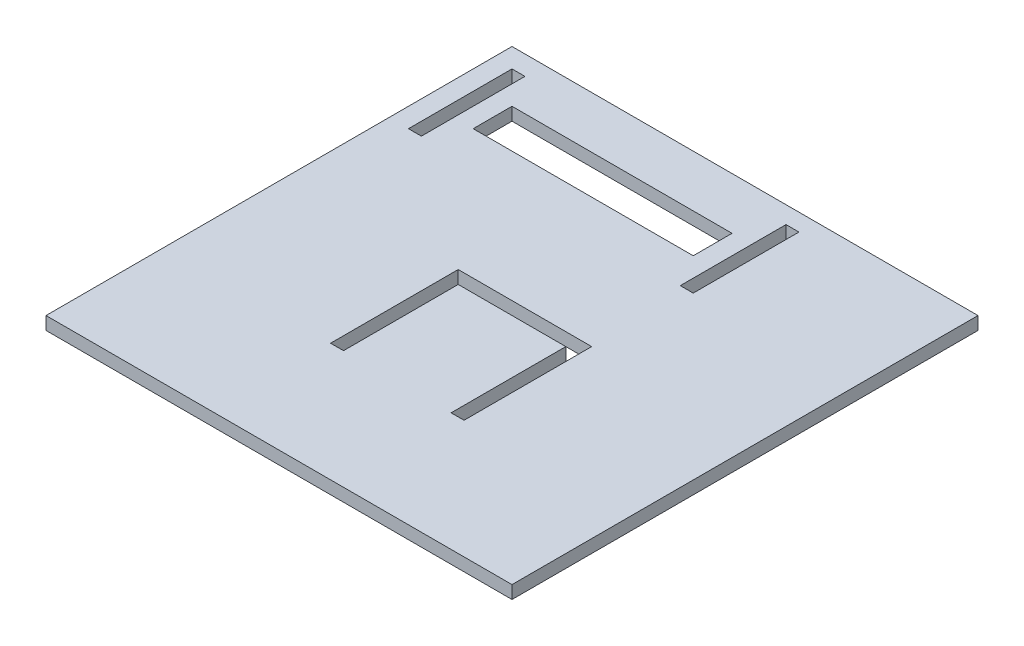
ISO-10303-21;
HEADER;
FILE_DESCRIPTION(('STEP AP214'),'2;1');
FILE_NAME('part.step','',(''),(''),'','','');
FILE_SCHEMA(('AUTOMOTIVE_DESIGN { 1 0 10303 214 1 1 1 1 }'));
ENDSEC;
DATA;
#1=APPLICATION_CONTEXT('core data for automotive mechanical design processes');
#2=APPLICATION_PROTOCOL_DEFINITION('international standard','automotive_design',2000,#1);
#3=PRODUCT_CONTEXT('',#1,'mechanical');
#4=PRODUCT('Part','Part','',(#3));
#5=PRODUCT_RELATED_PRODUCT_CATEGORY('part','',(#4));
#6=PRODUCT_DEFINITION_FORMATION('','',#4);
#7=PRODUCT_DEFINITION_CONTEXT('part definition',#1,'design');
#8=PRODUCT_DEFINITION('design','',#6,#7);
#9=PRODUCT_DEFINITION_SHAPE('','',#8);
#10=(LENGTH_UNIT() NAMED_UNIT(*) SI_UNIT(.MILLI.,.METRE.));
#11=(NAMED_UNIT(*) PLANE_ANGLE_UNIT() SI_UNIT($,.RADIAN.));
#12=(NAMED_UNIT(*) SI_UNIT($,.STERADIAN.) SOLID_ANGLE_UNIT());
#13=UNCERTAINTY_MEASURE_WITH_UNIT(LENGTH_MEASURE(1.E-05),#10,'distance_accuracy_value','');
#14=(GEOMETRIC_REPRESENTATION_CONTEXT(3) GLOBAL_UNCERTAINTY_ASSIGNED_CONTEXT((#13)) GLOBAL_UNIT_ASSIGNED_CONTEXT((#10,
#11,#12)) REPRESENTATION_CONTEXT('',''));
#15=CARTESIAN_POINT('',(0.,0.,0.));
#16=DIRECTION('',(0.,0.,1.));
#17=DIRECTION('',(1.,0.,0.));
#18=AXIS2_PLACEMENT_3D('',#15,#16,#17);
#19=CARTESIAN_POINT('',(0.,-3.175,-52.923862634009));
#20=DIRECTION('',(0.,0.,1.));
#21=DIRECTION('',(1.,0.,0.));
#22=AXIS2_PLACEMENT_3D('',#19,#20,#21);
#23=PLANE('',#22);
#24=DIRECTION('',(1.,0.,0.));
#25=VECTOR('',#24,1.);
#26=CARTESIAN_POINT('',(0.,0.,-52.923862634009));
#27=LINE('',#26,#25);
#28=CARTESIAN_POINT('',(14.2875,0.,-52.923862634009));
#29=VERTEX_POINT('',#28);
#30=CARTESIAN_POINT('',(17.4625,0.,-52.923862634009));
#31=VERTEX_POINT('',#30);
#32=EDGE_CURVE('E285',#29,#31,#27,.T.);
#33=ORIENTED_EDGE('',*,*,#32,.F.);
#34=DIRECTION('',(0.,1.,0.));
#35=VECTOR('',#34,1.);
#36=CARTESIAN_POINT('',(14.2875,-3.175,-52.923862634009));
#37=LINE('',#36,#35);
#38=CARTESIAN_POINT('',(14.2875,-3.175,-52.923862634009));
#39=VERTEX_POINT('',#38);
#40=EDGE_CURVE('E11',#39,#29,#37,.T.);
#41=ORIENTED_EDGE('',*,*,#40,.F.);
#42=DIRECTION('',(1.,0.,0.));
#43=VECTOR('',#42,1.);
#44=CARTESIAN_POINT('',(0.,-3.175,-52.923862634009));
#45=LINE('',#44,#43);
#46=CARTESIAN_POINT('',(17.4625,-3.175,-52.923862634009));
#47=VERTEX_POINT('',#46);
#48=EDGE_CURVE('E224',#39,#47,#45,.T.);
#49=ORIENTED_EDGE('',*,*,#48,.T.);
#50=DIRECTION('',(0.,1.,0.));
#51=VECTOR('',#50,1.);
#52=CARTESIAN_POINT('',(17.4625,-3.175,-52.923862634009));
#53=LINE('',#52,#51);
#54=EDGE_CURVE('E221',#47,#31,#53,.T.);
#55=ORIENTED_EDGE('',*,*,#54,.T.);
#56=EDGE_LOOP('',(#33,#41,#49,#55));
#57=FACE_BOUND('',#56,.T.);
#58=ADVANCED_FACE('F37',(#57),#23,.T.);
#59=CARTESIAN_POINT('',(14.2875,-3.175,0.));
#60=DIRECTION('',(-1.,0.,0.));
#61=DIRECTION('',(0.,0.,1.));
#62=AXIS2_PLACEMENT_3D('',#59,#60,#61);
#63=PLANE('',#62);
#64=DIRECTION('',(0.,0.,1.));
#65=VECTOR('',#64,1.);
#66=CARTESIAN_POINT('',(14.2875,0.,0.));
#67=LINE('',#66,#65);
#68=CARTESIAN_POINT('',(14.2875,0.,-26.9875));
#69=VERTEX_POINT('',#68);
#70=EDGE_CURVE('E291',#29,#69,#67,.T.);
#71=ORIENTED_EDGE('',*,*,#70,.T.);
#72=DIRECTION('',(0.,1.,0.));
#73=VECTOR('',#72,1.);
#74=CARTESIAN_POINT('',(14.2875,-3.175,-26.9875));
#75=LINE('',#74,#73);
#76=CARTESIAN_POINT('',(14.2875,-3.175,-26.9875));
#77=VERTEX_POINT('',#76);
#78=EDGE_CURVE('E47',#77,#69,#75,.T.);
#79=ORIENTED_EDGE('',*,*,#78,.F.);
#80=DIRECTION('',(0.,0.,1.));
#81=VECTOR('',#80,1.);
#82=CARTESIAN_POINT('',(14.2875,-3.175,0.));
#83=LINE('',#82,#81);
#84=EDGE_CURVE('E213',#39,#77,#83,.T.);
#85=ORIENTED_EDGE('',*,*,#84,.F.);
#86=ORIENTED_EDGE('',*,*,#40,.T.);
#87=EDGE_LOOP('',(#71,#79,#85,#86));
#88=FACE_BOUND('',#87,.T.);
#89=ADVANCED_FACE('F424',(#88),#63,.F.);
#90=CARTESIAN_POINT('',(0.,-3.175,-26.9875));
#91=DIRECTION('',(0.,0.,1.));
#92=DIRECTION('',(1.,0.,0.));
#93=AXIS2_PLACEMENT_3D('',#90,#91,#92);
#94=PLANE('',#93);
#95=DIRECTION('',(1.,0.,0.));
#96=VECTOR('',#95,1.);
#97=CARTESIAN_POINT('',(0.,0.,-26.9875));
#98=LINE('',#97,#96);
#99=CARTESIAN_POINT('',(17.4625,0.,-26.9875));
#100=VERTEX_POINT('',#99);
#101=EDGE_CURVE('E132',#69,#100,#98,.T.);
#102=ORIENTED_EDGE('',*,*,#101,.T.);
#103=DIRECTION('',(0.,1.,0.));
#104=VECTOR('',#103,1.);
#105=CARTESIAN_POINT('',(17.4625,-3.175,-26.9875));
#106=LINE('',#105,#104);
#107=CARTESIAN_POINT('',(17.4625,-3.175,-26.9875));
#108=VERTEX_POINT('',#107);
#109=EDGE_CURVE('E217',#108,#100,#106,.T.);
#110=ORIENTED_EDGE('',*,*,#109,.F.);
#111=DIRECTION('',(1.,0.,0.));
#112=VECTOR('',#111,1.);
#113=CARTESIAN_POINT('',(0.,-3.175,-26.9875));
#114=LINE('',#113,#112);
#115=EDGE_CURVE('E207',#77,#108,#114,.T.);
#116=ORIENTED_EDGE('',*,*,#115,.F.);
#117=ORIENTED_EDGE('',*,*,#78,.T.);
#118=EDGE_LOOP('',(#102,#110,#116,#117));
#119=FACE_BOUND('',#118,.T.);
#120=ADVANCED_FACE('F218',(#119),#94,.F.);
#121=CARTESIAN_POINT('',(0.,-3.175,57.15));
#122=DIRECTION('',(0.,0.,1.));
#123=DIRECTION('',(1.,0.,0.));
#124=AXIS2_PLACEMENT_3D('',#121,#122,#123);
#125=PLANE('',#124);
#126=DIRECTION('',(1.,0.,0.));
#127=VECTOR('',#126,1.);
#128=CARTESIAN_POINT('',(0.,0.,57.15));
#129=LINE('',#128,#127);
#130=CARTESIAN_POINT('',(-57.15,0.,57.15));
#131=VERTEX_POINT('',#130);
#132=CARTESIAN_POINT('',(57.15,0.,57.15));
#133=VERTEX_POINT('',#132);
#134=EDGE_CURVE('E273',#131,#133,#129,.T.);
#135=ORIENTED_EDGE('',*,*,#134,.F.);
#136=DIRECTION('',(0.,1.,0.));
#137=VECTOR('',#136,1.);
#138=CARTESIAN_POINT('',(-57.15,-3.175,57.15));
#139=LINE('',#138,#137);
#140=CARTESIAN_POINT('',(-57.15,-3.175,57.15));
#141=VERTEX_POINT('',#140);
#142=EDGE_CURVE('E296',#141,#131,#139,.T.);
#143=ORIENTED_EDGE('',*,*,#142,.F.);
#144=DIRECTION('',(1.,0.,0.));
#145=VECTOR('',#144,1.);
#146=CARTESIAN_POINT('',(0.,-3.175,57.15));
#147=LINE('',#146,#145);
#148=CARTESIAN_POINT('',(57.15,-3.175,57.15));
#149=VERTEX_POINT('',#148);
#150=EDGE_CURVE('E395',#141,#149,#147,.T.);
#151=ORIENTED_EDGE('',*,*,#150,.T.);
#152=DIRECTION('',(0.,1.,0.));
#153=VECTOR('',#152,1.);
#154=CARTESIAN_POINT('',(57.15,-3.175,57.15));
#155=LINE('',#154,#153);
#156=EDGE_CURVE('E303',#149,#133,#155,.T.);
#157=ORIENTED_EDGE('',*,*,#156,.T.);
#158=EDGE_LOOP('',(#135,#143,#151,#157));
#159=FACE_BOUND('',#158,.T.);
#160=ADVANCED_FACE('F419',(#159),#125,.T.);
#161=CARTESIAN_POINT('',(-57.15,-3.175,0.));
#162=DIRECTION('',(1.,0.,0.));
#163=DIRECTION('',(0.,0.,-1.));
#164=AXIS2_PLACEMENT_3D('',#161,#162,#163);
#165=PLANE('',#164);
#166=DIRECTION('',(0.,0.,-1.));
#167=VECTOR('',#166,1.);
#168=CARTESIAN_POINT('',(-57.15,0.,0.));
#169=LINE('',#168,#167);
#170=CARTESIAN_POINT('',(-57.15,0.,-57.15));
#171=VERTEX_POINT('',#170);
#172=EDGE_CURVE('E282',#131,#171,#169,.T.);
#173=ORIENTED_EDGE('',*,*,#172,.T.);
#174=DIRECTION('',(0.,1.,0.));
#175=VECTOR('',#174,1.);
#176=CARTESIAN_POINT('',(-57.15,-3.175,-57.15));
#177=LINE('',#176,#175);
#178=CARTESIAN_POINT('',(-57.15,-3.175,-57.15));
#179=VERTEX_POINT('',#178);
#180=EDGE_CURVE('E298',#179,#171,#177,.T.);
#181=ORIENTED_EDGE('',*,*,#180,.F.);
#182=DIRECTION('',(0.,0.,-1.));
#183=VECTOR('',#182,1.);
#184=CARTESIAN_POINT('',(-57.15,-3.175,0.));
#185=LINE('',#184,#183);
#186=EDGE_CURVE('E226',#141,#179,#185,.T.);
#187=ORIENTED_EDGE('',*,*,#186,.F.);
#188=ORIENTED_EDGE('',*,*,#142,.T.);
#189=EDGE_LOOP('',(#173,#181,#187,#188));
#190=FACE_BOUND('',#189,.T.);
#191=ADVANCED_FACE('F410',(#190),#165,.F.);
#192=CARTESIAN_POINT('',(0.,-3.175,-57.15));
#193=DIRECTION('',(0.,0.,1.));
#194=DIRECTION('',(1.,0.,0.));
#195=AXIS2_PLACEMENT_3D('',#192,#193,#194);
#196=PLANE('',#195);
#197=DIRECTION('',(1.,0.,0.));
#198=VECTOR('',#197,1.);
#199=CARTESIAN_POINT('',(0.,0.,-57.15));
#200=LINE('',#199,#198);
#201=CARTESIAN_POINT('',(57.15,0.,-57.15));
#202=VERTEX_POINT('',#201);
#203=EDGE_CURVE('E279',#171,#202,#200,.T.);
#204=ORIENTED_EDGE('',*,*,#203,.T.);
#205=DIRECTION('',(0.,1.,0.));
#206=VECTOR('',#205,1.);
#207=CARTESIAN_POINT('',(57.15,-3.175,-57.15));
#208=LINE('',#207,#206);
#209=CARTESIAN_POINT('',(57.15,-3.175,-57.15));
#210=VERTEX_POINT('',#209);
#211=EDGE_CURVE('E301',#210,#202,#208,.T.);
#212=ORIENTED_EDGE('',*,*,#211,.F.);
#213=DIRECTION('',(1.,0.,0.));
#214=VECTOR('',#213,1.);
#215=CARTESIAN_POINT('',(0.,-3.175,-57.15));
#216=LINE('',#215,#214);
#217=EDGE_CURVE('E401',#179,#210,#216,.T.);
#218=ORIENTED_EDGE('',*,*,#217,.F.);
#219=ORIENTED_EDGE('',*,*,#180,.T.);
#220=EDGE_LOOP('',(#204,#212,#218,#219));
#221=FACE_BOUND('',#220,.T.);
#222=ADVANCED_FACE('F413',(#221),#196,.F.);
#223=CARTESIAN_POINT('',(0.,-3.175,28.1323095017298));
#224=DIRECTION('',(0.,0.,1.));
#225=DIRECTION('',(1.,0.,0.));
#226=AXIS2_PLACEMENT_3D('',#223,#224,#225);
#227=PLANE('',#226);
#228=DIRECTION('',(1.,0.,0.));
#229=VECTOR('',#228,1.);
#230=CARTESIAN_POINT('',(0.,0.,28.1323095017298));
#231=LINE('',#230,#229);
#232=CARTESIAN_POINT('',(13.1953,0.,28.1323095017298));
#233=VERTEX_POINT('',#232);
#234=CARTESIAN_POINT('',(16.3703,0.,28.1323095017298));
#235=VERTEX_POINT('',#234);
#236=EDGE_CURVE('E253',#233,#235,#231,.T.);
#237=ORIENTED_EDGE('',*,*,#236,.T.);
#238=DIRECTION('',(0.,1.,0.));
#239=VECTOR('',#238,1.);
#240=CARTESIAN_POINT('',(16.3703,-3.175,28.1323095017298));
#241=LINE('',#240,#239);
#242=CARTESIAN_POINT('',(16.3703,-3.175,28.1323095017298));
#243=VERTEX_POINT('',#242);
#244=EDGE_CURVE('E305',#243,#235,#241,.T.);
#245=ORIENTED_EDGE('',*,*,#244,.F.);
#246=DIRECTION('',(1.,0.,0.));
#247=VECTOR('',#246,1.);
#248=CARTESIAN_POINT('',(0.,-3.175,28.1323095017298));
#249=LINE('',#248,#247);
#250=CARTESIAN_POINT('',(13.1953,-3.175,28.1323095017298));
#251=VERTEX_POINT('',#250);
#252=EDGE_CURVE('E376',#251,#243,#249,.T.);
#253=ORIENTED_EDGE('',*,*,#252,.F.);
#254=DIRECTION('',(0.,1.,0.));
#255=VECTOR('',#254,1.);
#256=CARTESIAN_POINT('',(13.1953,-3.175,28.1323095017298));
#257=LINE('',#256,#255);
#258=EDGE_CURVE('E322',#251,#233,#257,.T.);
#259=ORIENTED_EDGE('',*,*,#258,.T.);
#260=EDGE_LOOP('',(#237,#245,#253,#259));
#261=FACE_BOUND('',#260,.T.);
#262=ADVANCED_FACE('F437',(#261),#227,.F.);
#263=CARTESIAN_POINT('',(16.3703,-3.175,0.));
#264=DIRECTION('',(-1.,0.,0.));
#265=DIRECTION('',(0.,0.,1.));
#266=AXIS2_PLACEMENT_3D('',#263,#264,#265);
#267=PLANE('',#266);
#268=DIRECTION('',(0.,0.,1.));
#269=VECTOR('',#268,1.);
#270=CARTESIAN_POINT('',(16.3703,0.,0.));
#271=LINE('',#270,#269);
#272=CARTESIAN_POINT('',(16.3703,0.,-3.175));
#273=VERTEX_POINT('',#272);
#274=EDGE_CURVE('E270',#273,#235,#271,.T.);
#275=ORIENTED_EDGE('',*,*,#274,.F.);
#276=DIRECTION('',(0.,1.,0.));
#277=VECTOR('',#276,1.);
#278=CARTESIAN_POINT('',(16.3703,-3.175,-3.175));
#279=LINE('',#278,#277);
#280=CARTESIAN_POINT('',(16.3703,-3.175,-3.175));
#281=VERTEX_POINT('',#280);
#282=EDGE_CURVE('E307',#281,#273,#279,.T.);
#283=ORIENTED_EDGE('',*,*,#282,.F.);
#284=DIRECTION('',(0.,0.,1.));
#285=VECTOR('',#284,1.);
#286=CARTESIAN_POINT('',(16.3703,-3.175,0.));
#287=LINE('',#286,#285);
#288=EDGE_CURVE('E392',#281,#243,#287,.T.);
#289=ORIENTED_EDGE('',*,*,#288,.T.);
#290=ORIENTED_EDGE('',*,*,#244,.T.);
#291=EDGE_LOOP('',(#275,#283,#289,#290));
#292=FACE_BOUND('',#291,.T.);
#293=ADVANCED_FACE('F443',(#292),#267,.T.);
#294=CARTESIAN_POINT('',(0.,-3.175,-3.175));
#295=DIRECTION('',(0.,0.,1.));
#296=DIRECTION('',(1.,0.,0.));
#297=AXIS2_PLACEMENT_3D('',#294,#295,#296);
#298=PLANE('',#297);
#299=DIRECTION('',(1.,0.,0.));
#300=VECTOR('',#299,1.);
#301=CARTESIAN_POINT('',(0.,0.,-3.175));
#302=LINE('',#301,#300);
#303=CARTESIAN_POINT('',(-16.3703,0.,-3.17499999999999));
#304=VERTEX_POINT('',#303);
#305=EDGE_CURVE('E267',#304,#273,#302,.T.);
#306=ORIENTED_EDGE('',*,*,#305,.F.);
#307=DIRECTION('',(0.,1.,0.));
#308=VECTOR('',#307,1.);
#309=CARTESIAN_POINT('',(-16.3703,-3.175,-3.17499999999999));
#310=LINE('',#309,#308);
#311=CARTESIAN_POINT('',(-16.3703,-3.175,-3.17499999999999));
#312=VERTEX_POINT('',#311);
#313=EDGE_CURVE('E309',#312,#304,#310,.T.);
#314=ORIENTED_EDGE('',*,*,#313,.F.);
#315=DIRECTION('',(1.,0.,0.));
#316=VECTOR('',#315,1.);
#317=CARTESIAN_POINT('',(0.,-3.175,-3.175));
#318=LINE('',#317,#316);
#319=EDGE_CURVE('E389',#312,#281,#318,.T.);
#320=ORIENTED_EDGE('',*,*,#319,.T.);
#321=ORIENTED_EDGE('',*,*,#282,.T.);
#322=EDGE_LOOP('',(#306,#314,#320,#321));
#323=FACE_BOUND('',#322,.T.);
#324=ADVANCED_FACE('F446',(#323),#298,.T.);
#325=CARTESIAN_POINT('',(-16.3703,-3.175,0.));
#326=DIRECTION('',(1.,0.,0.));
#327=DIRECTION('',(0.,0.,-1.));
#328=AXIS2_PLACEMENT_3D('',#325,#326,#327);
#329=PLANE('',#328);
#330=DIRECTION('',(0.,0.,-1.));
#331=VECTOR('',#330,1.);
#332=CARTESIAN_POINT('',(-16.3703,0.,0.));
#333=LINE('',#332,#331);
#334=CARTESIAN_POINT('',(-16.3703,0.,28.1323095017298));
#335=VERTEX_POINT('',#334);
#336=EDGE_CURVE('E264',#335,#304,#333,.T.);
#337=ORIENTED_EDGE('',*,*,#336,.F.);
#338=DIRECTION('',(0.,1.,0.));
#339=VECTOR('',#338,1.);
#340=CARTESIAN_POINT('',(-16.3703,-3.175,28.1323095017298));
#341=LINE('',#340,#339);
#342=CARTESIAN_POINT('',(-16.3703,-3.175,28.1323095017298));
#343=VERTEX_POINT('',#342);
#344=EDGE_CURVE('E311',#343,#335,#341,.T.);
#345=ORIENTED_EDGE('',*,*,#344,.F.);
#346=DIRECTION('',(0.,0.,-1.));
#347=VECTOR('',#346,1.);
#348=CARTESIAN_POINT('',(-16.3703,-3.175,0.));
#349=LINE('',#348,#347);
#350=EDGE_CURVE('E386',#343,#312,#349,.T.);
#351=ORIENTED_EDGE('',*,*,#350,.T.);
#352=ORIENTED_EDGE('',*,*,#313,.T.);
#353=EDGE_LOOP('',(#337,#345,#351,#352));
#354=FACE_BOUND('',#353,.T.);
#355=ADVANCED_FACE('F450',(#354),#329,.T.);
#356=CARTESIAN_POINT('',(0.,-3.175,28.1323095017298));
#357=DIRECTION('',(0.,0.,1.));
#358=DIRECTION('',(1.,0.,0.));
#359=AXIS2_PLACEMENT_3D('',#356,#357,#358);
#360=PLANE('',#359);
#361=DIRECTION('',(1.,0.,0.));
#362=VECTOR('',#361,1.);
#363=CARTESIAN_POINT('',(0.,0.,28.1323095017298));
#364=LINE('',#363,#362);
#365=CARTESIAN_POINT('',(-13.1953,0.,28.1323095017298));
#366=VERTEX_POINT('',#365);
#367=EDGE_CURVE('E262',#335,#366,#364,.T.);
#368=ORIENTED_EDGE('',*,*,#367,.T.);
#369=DIRECTION('',(0.,1.,0.));
#370=VECTOR('',#369,1.);
#371=CARTESIAN_POINT('',(-13.1953,-3.175,28.1323095017298));
#372=LINE('',#371,#370);
#373=CARTESIAN_POINT('',(-13.1953,-3.175,28.1323095017298));
#374=VERTEX_POINT('',#373);
#375=EDGE_CURVE('E313',#374,#366,#372,.T.);
#376=ORIENTED_EDGE('',*,*,#375,.F.);
#377=DIRECTION('',(1.,0.,0.));
#378=VECTOR('',#377,1.);
#379=CARTESIAN_POINT('',(0.,-3.175,28.1323095017298));
#380=LINE('',#379,#378);
#381=EDGE_CURVE('E384',#343,#374,#380,.T.);
#382=ORIENTED_EDGE('',*,*,#381,.F.);
#383=ORIENTED_EDGE('',*,*,#344,.T.);
#384=EDGE_LOOP('',(#368,#376,#382,#383));
#385=FACE_BOUND('',#384,.T.);
#386=ADVANCED_FACE('F454',(#385),#360,.F.);
#387=CARTESIAN_POINT('',(-13.1953,-3.175,0.));
#388=DIRECTION('',(1.,0.,0.));
#389=DIRECTION('',(0.,0.,-1.));
#390=AXIS2_PLACEMENT_3D('',#387,#388,#389);
#391=PLANE('',#390);
#392=DIRECTION('',(0.,0.,-1.));
#393=VECTOR('',#392,1.);
#394=CARTESIAN_POINT('',(-13.1953,0.,0.));
#395=LINE('',#394,#393);
#396=CARTESIAN_POINT('',(-13.1953,0.,0.));
#397=VERTEX_POINT('',#396);
#398=EDGE_CURVE('E260',#366,#397,#395,.T.);
#399=ORIENTED_EDGE('',*,*,#398,.T.);
#400=DIRECTION('',(0.,1.,0.));
#401=VECTOR('',#400,1.);
#402=CARTESIAN_POINT('',(-13.1953,-3.175,0.));
#403=LINE('',#402,#401);
#404=CARTESIAN_POINT('',(-13.1953,-3.175,0.));
#405=VERTEX_POINT('',#404);
#406=EDGE_CURVE('E316',#405,#397,#403,.T.);
#407=ORIENTED_EDGE('',*,*,#406,.F.);
#408=DIRECTION('',(0.,0.,-1.));
#409=VECTOR('',#408,1.);
#410=CARTESIAN_POINT('',(-13.1953,-3.175,0.));
#411=LINE('',#410,#409);
#412=EDGE_CURVE('E382',#374,#405,#411,.T.);
#413=ORIENTED_EDGE('',*,*,#412,.F.);
#414=ORIENTED_EDGE('',*,*,#375,.T.);
#415=EDGE_LOOP('',(#399,#407,#413,#414));
#416=FACE_BOUND('',#415,.T.);
#417=ADVANCED_FACE('F458',(#416),#391,.F.);
#418=CARTESIAN_POINT('',(0.,-3.175,0.));
#419=DIRECTION('',(0.,0.,1.));
#420=DIRECTION('',(1.,0.,0.));
#421=AXIS2_PLACEMENT_3D('',#418,#419,#420);
#422=PLANE('',#421);
#423=DIRECTION('',(1.,0.,0.));
#424=VECTOR('',#423,1.);
#425=CARTESIAN_POINT('',(0.,0.,0.));
#426=LINE('',#425,#424);
#427=CARTESIAN_POINT('',(13.1953,0.,0.));
#428=VERTEX_POINT('',#427);
#429=EDGE_CURVE('E258',#397,#428,#426,.T.);
#430=ORIENTED_EDGE('',*,*,#429,.T.);
#431=DIRECTION('',(0.,1.,0.));
#432=VECTOR('',#431,1.);
#433=CARTESIAN_POINT('',(13.1953,-3.175,0.));
#434=LINE('',#433,#432);
#435=CARTESIAN_POINT('',(13.1953,-3.175,0.));
#436=VERTEX_POINT('',#435);
#437=EDGE_CURVE('E319',#436,#428,#434,.T.);
#438=ORIENTED_EDGE('',*,*,#437,.F.);
#439=DIRECTION('',(1.,0.,0.));
#440=VECTOR('',#439,1.);
#441=CARTESIAN_POINT('',(0.,-3.175,0.));
#442=LINE('',#441,#440);
#443=EDGE_CURVE('E380',#405,#436,#442,.T.);
#444=ORIENTED_EDGE('',*,*,#443,.F.);
#445=ORIENTED_EDGE('',*,*,#406,.T.);
#446=EDGE_LOOP('',(#430,#438,#444,#445));
#447=FACE_BOUND('',#446,.T.);
#448=ADVANCED_FACE('F462',(#447),#422,.F.);
#449=CARTESIAN_POINT('',(9.52499999999999,-3.175,0.));
#450=DIRECTION('',(1.,0.,0.));
#451=DIRECTION('',(0.,0.,-1.));
#452=AXIS2_PLACEMENT_3D('',#449,#450,#451);
#453=PLANE('',#452);
#454=DIRECTION('',(0.,0.,-1.));
#455=VECTOR('',#454,1.);
#456=CARTESIAN_POINT('',(9.52499999999999,0.,0.));
#457=LINE('',#456,#455);
#458=CARTESIAN_POINT('',(9.52499999999999,0.,-34.925));
#459=VERTEX_POINT('',#458);
#460=CARTESIAN_POINT('',(9.52499999999999,0.,-44.45));
#461=VERTEX_POINT('',#460);
#462=EDGE_CURVE('E242',#459,#461,#457,.T.);
#463=ORIENTED_EDGE('',*,*,#462,.T.);
#464=DIRECTION('',(0.,1.,0.));
#465=VECTOR('',#464,1.);
#466=CARTESIAN_POINT('',(9.52499999999999,-3.175,-44.45));
#467=LINE('',#466,#465);
#468=CARTESIAN_POINT('',(9.52499999999999,-3.175,-44.45));
#469=VERTEX_POINT('',#468);
#470=EDGE_CURVE('E325',#469,#461,#467,.T.);
#471=ORIENTED_EDGE('',*,*,#470,.F.);
#472=DIRECTION('',(0.,0.,-1.));
#473=VECTOR('',#472,1.);
#474=CARTESIAN_POINT('',(9.52499999999999,-3.175,0.));
#475=LINE('',#474,#473);
#476=CARTESIAN_POINT('',(9.52499999999999,-3.175,-34.925));
#477=VERTEX_POINT('',#476);
#478=EDGE_CURVE('E362',#477,#469,#475,.T.);
#479=ORIENTED_EDGE('',*,*,#478,.F.);
#480=DIRECTION('',(0.,1.,0.));
#481=VECTOR('',#480,1.);
#482=CARTESIAN_POINT('',(9.52499999999999,-3.175,-34.925));
#483=LINE('',#482,#481);
#484=EDGE_CURVE('E331',#477,#459,#483,.T.);
#485=ORIENTED_EDGE('',*,*,#484,.T.);
#486=EDGE_LOOP('',(#463,#471,#479,#485));
#487=FACE_BOUND('',#486,.T.);
#488=ADVANCED_FACE('F466',(#487),#453,.F.);
#489=CARTESIAN_POINT('',(0.,-3.175,-44.45));
#490=DIRECTION('',(0.,0.,1.));
#491=DIRECTION('',(1.,0.,0.));
#492=AXIS2_PLACEMENT_3D('',#489,#490,#491);
#493=PLANE('',#492);
#494=DIRECTION('',(1.,0.,0.));
#495=VECTOR('',#494,1.);
#496=CARTESIAN_POINT('',(0.,0.,-44.45));
#497=LINE('',#496,#495);
#498=CARTESIAN_POINT('',(-44.45,0.,-44.45));
#499=VERTEX_POINT('',#498);
#500=EDGE_CURVE('E250',#499,#461,#497,.T.);
#501=ORIENTED_EDGE('',*,*,#500,.F.);
#502=DIRECTION('',(0.,1.,0.));
#503=VECTOR('',#502,1.);
#504=CARTESIAN_POINT('',(-44.45,-3.175,-44.45));
#505=LINE('',#504,#503);
#506=CARTESIAN_POINT('',(-44.45,-3.175,-44.45));
#507=VERTEX_POINT('',#506);
#508=EDGE_CURVE('E327',#507,#499,#505,.T.);
#509=ORIENTED_EDGE('',*,*,#508,.F.);
#510=DIRECTION('',(1.,0.,0.));
#511=VECTOR('',#510,1.);
#512=CARTESIAN_POINT('',(0.,-3.175,-44.45));
#513=LINE('',#512,#511);
#514=EDGE_CURVE('E373',#507,#469,#513,.T.);
#515=ORIENTED_EDGE('',*,*,#514,.T.);
#516=ORIENTED_EDGE('',*,*,#470,.T.);
#517=EDGE_LOOP('',(#501,#509,#515,#516));
#518=FACE_BOUND('',#517,.T.);
#519=ADVANCED_FACE('F475',(#518),#493,.T.);
#520=CARTESIAN_POINT('',(-44.45,-3.175,0.));
#521=DIRECTION('',(1.,0.,0.));
#522=DIRECTION('',(0.,0.,-1.));
#523=AXIS2_PLACEMENT_3D('',#520,#521,#522);
#524=PLANE('',#523);
#525=DIRECTION('',(0.,0.,-1.));
#526=VECTOR('',#525,1.);
#527=CARTESIAN_POINT('',(-44.45,0.,0.));
#528=LINE('',#527,#526);
#529=CARTESIAN_POINT('',(-44.45,0.,-34.925));
#530=VERTEX_POINT('',#529);
#531=EDGE_CURVE('E247',#530,#499,#528,.T.);
#532=ORIENTED_EDGE('',*,*,#531,.F.);
#533=DIRECTION('',(0.,1.,0.));
#534=VECTOR('',#533,1.);
#535=CARTESIAN_POINT('',(-44.45,-3.175,-34.925));
#536=LINE('',#535,#534);
#537=CARTESIAN_POINT('',(-44.45,-3.175,-34.925));
#538=VERTEX_POINT('',#537);
#539=EDGE_CURVE('E329',#538,#530,#536,.T.);
#540=ORIENTED_EDGE('',*,*,#539,.F.);
#541=DIRECTION('',(0.,0.,-1.));
#542=VECTOR('',#541,1.);
#543=CARTESIAN_POINT('',(-44.45,-3.175,0.));
#544=LINE('',#543,#542);
#545=EDGE_CURVE('E370',#538,#507,#544,.T.);
#546=ORIENTED_EDGE('',*,*,#545,.T.);
#547=ORIENTED_EDGE('',*,*,#508,.T.);
#548=EDGE_LOOP('',(#532,#540,#546,#547));
#549=FACE_BOUND('',#548,.T.);
#550=ADVANCED_FACE('F478',(#549),#524,.T.);
#551=CARTESIAN_POINT('',(0.,-3.175,-52.3875));
#552=DIRECTION('',(0.,0.,1.));
#553=DIRECTION('',(1.,0.,0.));
#554=AXIS2_PLACEMENT_3D('',#551,#552,#553);
#555=PLANE('',#554);
#556=DIRECTION('',(1.,0.,0.));
#557=VECTOR('',#556,1.);
#558=CARTESIAN_POINT('',(0.,0.,-52.3875));
#559=LINE('',#558,#557);
#560=CARTESIAN_POINT('',(-52.3875,0.,-52.3875));
#561=VERTEX_POINT('',#560);
#562=CARTESIAN_POINT('',(-49.2125,0.,-52.3875));
#563=VERTEX_POINT('',#562);
#564=EDGE_CURVE('E231',#561,#563,#559,.T.);
#565=ORIENTED_EDGE('',*,*,#564,.F.);
#566=DIRECTION('',(0.,1.,0.));
#567=VECTOR('',#566,1.);
#568=CARTESIAN_POINT('',(-52.3875,-3.175,-52.3875));
#569=LINE('',#568,#567);
#570=CARTESIAN_POINT('',(-52.3875,-3.175,-52.3875));
#571=VERTEX_POINT('',#570);
#572=EDGE_CURVE('E334',#571,#561,#569,.T.);
#573=ORIENTED_EDGE('',*,*,#572,.F.);
#574=DIRECTION('',(1.,0.,0.));
#575=VECTOR('',#574,1.);
#576=CARTESIAN_POINT('',(0.,-3.175,-52.3875));
#577=LINE('',#576,#575);
#578=CARTESIAN_POINT('',(-49.2125,-3.175,-52.3875));
#579=VERTEX_POINT('',#578);
#580=EDGE_CURVE('E292',#571,#579,#577,.T.);
#581=ORIENTED_EDGE('',*,*,#580,.T.);
#582=DIRECTION('',(0.,1.,0.));
#583=VECTOR('',#582,1.);
#584=CARTESIAN_POINT('',(-49.2125,-3.175,-52.3875));
#585=LINE('',#584,#583);
#586=EDGE_CURVE('E41',#579,#563,#585,.T.);
#587=ORIENTED_EDGE('',*,*,#586,.T.);
#588=EDGE_LOOP('',(#565,#573,#581,#587));
#589=FACE_BOUND('',#588,.T.);
#590=ADVANCED_FACE('F39',(#589),#555,.T.);
#591=CARTESIAN_POINT('',(-52.3875,-3.175,0.));
#592=DIRECTION('',(-1.,0.,0.));
#593=DIRECTION('',(0.,0.,1.));
#594=AXIS2_PLACEMENT_3D('',#591,#592,#593);
#595=PLANE('',#594);
#596=DIRECTION('',(0.,0.,1.));
#597=VECTOR('',#596,1.);
#598=CARTESIAN_POINT('',(-52.3875,0.,0.));
#599=LINE('',#598,#597);
#600=CARTESIAN_POINT('',(-52.3875,0.,-26.9875));
#601=VERTEX_POINT('',#600);
#602=EDGE_CURVE('E240',#561,#601,#599,.T.);
#603=ORIENTED_EDGE('',*,*,#602,.T.);
#604=DIRECTION('',(0.,1.,0.));
#605=VECTOR('',#604,1.);
#606=CARTESIAN_POINT('',(-52.3875,-3.175,-26.9875));
#607=LINE('',#606,#605);
#608=CARTESIAN_POINT('',(-52.3875,-3.175,-26.9875));
#609=VERTEX_POINT('',#608);
#610=EDGE_CURVE('E336',#609,#601,#607,.T.);
#611=ORIENTED_EDGE('',*,*,#610,.F.);
#612=DIRECTION('',(0.,0.,1.));
#613=VECTOR('',#612,1.);
#614=CARTESIAN_POINT('',(-52.3875,-3.175,0.));
#615=LINE('',#614,#613);
#616=EDGE_CURVE('E359',#571,#609,#615,.T.);
#617=ORIENTED_EDGE('',*,*,#616,.F.);
#618=ORIENTED_EDGE('',*,*,#572,.T.);
#619=EDGE_LOOP('',(#603,#611,#617,#618));
#620=FACE_BOUND('',#619,.T.);
#621=ADVANCED_FACE('F352',(#620),#595,.F.);
#622=CARTESIAN_POINT('',(0.,-3.175,-26.9875));
#623=DIRECTION('',(0.,0.,1.));
#624=DIRECTION('',(1.,0.,0.));
#625=AXIS2_PLACEMENT_3D('',#622,#623,#624);
#626=PLANE('',#625);
#627=DIRECTION('',(1.,0.,0.));
#628=VECTOR('',#627,1.);
#629=CARTESIAN_POINT('',(0.,0.,-26.9875));
#630=LINE('',#629,#628);
#631=CARTESIAN_POINT('',(-49.2125,0.,-26.9875));
#632=VERTEX_POINT('',#631);
#633=EDGE_CURVE('E237',#601,#632,#630,.T.);
#634=ORIENTED_EDGE('',*,*,#633,.T.);
#635=DIRECTION('',(0.,1.,0.));
#636=VECTOR('',#635,1.);
#637=CARTESIAN_POINT('',(-49.2125,-3.175,-26.9875));
#638=LINE('',#637,#636);
#639=CARTESIAN_POINT('',(-49.2125,-3.175,-26.9875));
#640=VERTEX_POINT('',#639);
#641=EDGE_CURVE('E338',#640,#632,#638,.T.);
#642=ORIENTED_EDGE('',*,*,#641,.F.);
#643=DIRECTION('',(1.,0.,0.));
#644=VECTOR('',#643,1.);
#645=CARTESIAN_POINT('',(0.,-3.175,-26.9875));
#646=LINE('',#645,#644);
#647=EDGE_CURVE('E357',#609,#640,#646,.T.);
#648=ORIENTED_EDGE('',*,*,#647,.F.);
#649=ORIENTED_EDGE('',*,*,#610,.T.);
#650=EDGE_LOOP('',(#634,#642,#648,#649));
#651=FACE_BOUND('',#650,.T.);
#652=ADVANCED_FACE('F356',(#651),#626,.F.);
#653=CARTESIAN_POINT('',(57.15,-3.175,0.));
#654=DIRECTION('',(1.,0.,0.));
#655=DIRECTION('',(0.,0.,-1.));
#656=AXIS2_PLACEMENT_3D('',#653,#654,#655);
#657=PLANE('',#656);
#658=DIRECTION('',(0.,0.,-1.));
#659=VECTOR('',#658,1.);
#660=CARTESIAN_POINT('',(57.15,0.,0.));
#661=LINE('',#660,#659);
#662=EDGE_CURVE('E276',#133,#202,#661,.T.);
#663=ORIENTED_EDGE('',*,*,#662,.F.);
#664=ORIENTED_EDGE('',*,*,#156,.F.);
#665=DIRECTION('',(0.,0.,-1.));
#666=VECTOR('',#665,1.);
#667=CARTESIAN_POINT('',(57.15,-3.175,0.));
#668=LINE('',#667,#666);
#669=EDGE_CURVE('E398',#149,#210,#668,.T.);
#670=ORIENTED_EDGE('',*,*,#669,.T.);
#671=ORIENTED_EDGE('',*,*,#211,.T.);
#672=EDGE_LOOP('',(#663,#664,#670,#671));
#673=FACE_BOUND('',#672,.T.);
#674=ADVANCED_FACE('F416',(#673),#657,.T.);
#675=CARTESIAN_POINT('',(13.1953,-3.175,0.));
#676=DIRECTION('',(-1.,0.,0.));
#677=DIRECTION('',(0.,0.,1.));
#678=AXIS2_PLACEMENT_3D('',#675,#676,#677);
#679=PLANE('',#678);
#680=DIRECTION('',(0.,0.,1.));
#681=VECTOR('',#680,1.);
#682=CARTESIAN_POINT('',(13.1953,0.,0.));
#683=LINE('',#682,#681);
#684=EDGE_CURVE('E256',#428,#233,#683,.T.);
#685=ORIENTED_EDGE('',*,*,#684,.T.);
#686=ORIENTED_EDGE('',*,*,#258,.F.);
#687=DIRECTION('',(0.,0.,1.));
#688=VECTOR('',#687,1.);
#689=CARTESIAN_POINT('',(13.1953,-3.175,0.));
#690=LINE('',#689,#688);
#691=EDGE_CURVE('E378',#436,#251,#690,.T.);
#692=ORIENTED_EDGE('',*,*,#691,.F.);
#693=ORIENTED_EDGE('',*,*,#437,.T.);
#694=EDGE_LOOP('',(#685,#686,#692,#693));
#695=FACE_BOUND('',#694,.T.);
#696=ADVANCED_FACE('F440',(#695),#679,.F.);
#697=CARTESIAN_POINT('',(0.,-3.175,-34.925));
#698=DIRECTION('',(0.,0.,1.));
#699=DIRECTION('',(1.,0.,0.));
#700=AXIS2_PLACEMENT_3D('',#697,#698,#699);
#701=PLANE('',#700);
#702=DIRECTION('',(1.,0.,0.));
#703=VECTOR('',#702,1.);
#704=CARTESIAN_POINT('',(0.,0.,-34.925));
#705=LINE('',#704,#703);
#706=EDGE_CURVE('E245',#530,#459,#705,.T.);
#707=ORIENTED_EDGE('',*,*,#706,.T.);
#708=ORIENTED_EDGE('',*,*,#484,.F.);
#709=DIRECTION('',(1.,0.,0.));
#710=VECTOR('',#709,1.);
#711=CARTESIAN_POINT('',(0.,-3.175,-34.925));
#712=LINE('',#711,#710);
#713=EDGE_CURVE('E368',#538,#477,#712,.T.);
#714=ORIENTED_EDGE('',*,*,#713,.F.);
#715=ORIENTED_EDGE('',*,*,#539,.T.);
#716=EDGE_LOOP('',(#707,#708,#714,#715));
#717=FACE_BOUND('',#716,.T.);
#718=ADVANCED_FACE('F470',(#717),#701,.F.);
#719=CARTESIAN_POINT('',(-49.2125,-3.175,0.));
#720=DIRECTION('',(-1.,0.,0.));
#721=DIRECTION('',(0.,0.,1.));
#722=AXIS2_PLACEMENT_3D('',#719,#720,#721);
#723=PLANE('',#722);
#724=DIRECTION('',(0.,0.,1.));
#725=VECTOR('',#724,1.);
#726=CARTESIAN_POINT('',(-49.2125,0.,0.));
#727=LINE('',#726,#725);
#728=EDGE_CURVE('E234',#563,#632,#727,.T.);
#729=ORIENTED_EDGE('',*,*,#728,.F.);
#730=ORIENTED_EDGE('',*,*,#586,.F.);
#731=DIRECTION('',(0.,0.,1.));
#732=VECTOR('',#731,1.);
#733=CARTESIAN_POINT('',(-49.2125,-3.175,0.));
#734=LINE('',#733,#732);
#735=EDGE_CURVE('E360',#579,#640,#734,.T.);
#736=ORIENTED_EDGE('',*,*,#735,.T.);
#737=ORIENTED_EDGE('',*,*,#641,.T.);
#738=EDGE_LOOP('',(#729,#730,#736,#737));
#739=FACE_BOUND('',#738,.T.);
#740=ADVANCED_FACE('F344',(#739),#723,.T.);
#741=CARTESIAN_POINT('',(17.4625,-3.175,0.));
#742=DIRECTION('',(-1.,0.,0.));
#743=DIRECTION('',(0.,0.,1.));
#744=AXIS2_PLACEMENT_3D('',#741,#742,#743);
#745=PLANE('',#744);
#746=DIRECTION('',(0.,0.,1.));
#747=VECTOR('',#746,1.);
#748=CARTESIAN_POINT('',(17.4625,0.,0.));
#749=LINE('',#748,#747);
#750=EDGE_CURVE('E288',#31,#100,#749,.T.);
#751=ORIENTED_EDGE('',*,*,#750,.F.);
#752=ORIENTED_EDGE('',*,*,#54,.F.);
#753=DIRECTION('',(0.,0.,1.));
#754=VECTOR('',#753,1.);
#755=CARTESIAN_POINT('',(17.4625,-3.175,0.));
#756=LINE('',#755,#754);
#757=EDGE_CURVE('E212',#47,#108,#756,.T.);
#758=ORIENTED_EDGE('',*,*,#757,.T.);
#759=ORIENTED_EDGE('',*,*,#109,.T.);
#760=EDGE_LOOP('',(#751,#752,#758,#759));
#761=FACE_BOUND('',#760,.T.);
#762=ADVANCED_FACE('F223',(#761),#745,.T.);
#763=CARTESIAN_POINT('',(0.,-3.175,0.));
#764=DIRECTION('',(0.,1.,0.));
#765=DIRECTION('',(0.,0.,1.));
#766=AXIS2_PLACEMENT_3D('',#763,#764,#765);
#767=PLANE('',#766);
#768=ORIENTED_EDGE('',*,*,#580,.F.);
#769=ORIENTED_EDGE('',*,*,#616,.T.);
#770=ORIENTED_EDGE('',*,*,#647,.T.);
#771=ORIENTED_EDGE('',*,*,#735,.F.);
#772=EDGE_LOOP('',(#768,#769,#770,#771));
#773=FACE_BOUND('',#772,.T.);
#774=ORIENTED_EDGE('',*,*,#478,.T.);
#775=ORIENTED_EDGE('',*,*,#514,.F.);
#776=ORIENTED_EDGE('',*,*,#545,.F.);
#777=ORIENTED_EDGE('',*,*,#713,.T.);
#778=EDGE_LOOP('',(#774,#775,#776,#777));
#779=FACE_BOUND('',#778,.T.);
#780=ORIENTED_EDGE('',*,*,#252,.T.);
#781=ORIENTED_EDGE('',*,*,#288,.F.);
#782=ORIENTED_EDGE('',*,*,#319,.F.);
#783=ORIENTED_EDGE('',*,*,#350,.F.);
#784=ORIENTED_EDGE('',*,*,#381,.T.);
#785=ORIENTED_EDGE('',*,*,#412,.T.);
#786=ORIENTED_EDGE('',*,*,#443,.T.);
#787=ORIENTED_EDGE('',*,*,#691,.T.);
#788=EDGE_LOOP('',(#780,#781,#782,#783,#784,#785,#786,#787));
#789=FACE_BOUND('',#788,.T.);
#790=ORIENTED_EDGE('',*,*,#150,.F.);
#791=ORIENTED_EDGE('',*,*,#186,.T.);
#792=ORIENTED_EDGE('',*,*,#217,.T.);
#793=ORIENTED_EDGE('',*,*,#669,.F.);
#794=EDGE_LOOP('',(#790,#791,#792,#793));
#795=FACE_BOUND('',#794,.T.);
#796=ORIENTED_EDGE('',*,*,#48,.F.);
#797=ORIENTED_EDGE('',*,*,#84,.T.);
#798=ORIENTED_EDGE('',*,*,#115,.T.);
#799=ORIENTED_EDGE('',*,*,#757,.F.);
#800=EDGE_LOOP('',(#796,#797,#798,#799));
#801=FACE_BOUND('',#800,.T.);
#802=ADVANCED_FACE('F210',(#773,#779,#789,#795,#801),#767,.F.);
#803=CARTESIAN_POINT('',(0.,0.,0.));
#804=DIRECTION('',(0.,1.,0.));
#805=DIRECTION('',(0.,0.,1.));
#806=AXIS2_PLACEMENT_3D('',#803,#804,#805);
#807=PLANE('',#806);
#808=ORIENTED_EDGE('',*,*,#564,.T.);
#809=ORIENTED_EDGE('',*,*,#728,.T.);
#810=ORIENTED_EDGE('',*,*,#633,.F.);
#811=ORIENTED_EDGE('',*,*,#602,.F.);
#812=EDGE_LOOP('',(#808,#809,#810,#811));
#813=FACE_BOUND('',#812,.T.);
#814=ORIENTED_EDGE('',*,*,#462,.F.);
#815=ORIENTED_EDGE('',*,*,#706,.F.);
#816=ORIENTED_EDGE('',*,*,#531,.T.);
#817=ORIENTED_EDGE('',*,*,#500,.T.);
#818=EDGE_LOOP('',(#814,#815,#816,#817));
#819=FACE_BOUND('',#818,.T.);
#820=ORIENTED_EDGE('',*,*,#236,.F.);
#821=ORIENTED_EDGE('',*,*,#684,.F.);
#822=ORIENTED_EDGE('',*,*,#429,.F.);
#823=ORIENTED_EDGE('',*,*,#398,.F.);
#824=ORIENTED_EDGE('',*,*,#367,.F.);
#825=ORIENTED_EDGE('',*,*,#336,.T.);
#826=ORIENTED_EDGE('',*,*,#305,.T.);
#827=ORIENTED_EDGE('',*,*,#274,.T.);
#828=EDGE_LOOP('',(#820,#821,#822,#823,#824,#825,#826,#827));
#829=FACE_BOUND('',#828,.T.);
#830=ORIENTED_EDGE('',*,*,#134,.T.);
#831=ORIENTED_EDGE('',*,*,#662,.T.);
#832=ORIENTED_EDGE('',*,*,#203,.F.);
#833=ORIENTED_EDGE('',*,*,#172,.F.);
#834=EDGE_LOOP('',(#830,#831,#832,#833));
#835=FACE_BOUND('',#834,.T.);
#836=ORIENTED_EDGE('',*,*,#32,.T.);
#837=ORIENTED_EDGE('',*,*,#750,.T.);
#838=ORIENTED_EDGE('',*,*,#101,.F.);
#839=ORIENTED_EDGE('',*,*,#70,.F.);
#840=EDGE_LOOP('',(#836,#837,#838,#839));
#841=FACE_BOUND('',#840,.T.);
#842=ADVANCED_FACE('F348',(#813,#819,#829,#835,#841),#807,.T.);
#843=CLOSED_SHELL('',(#58,#89,#120,#160,#191,#222,#262,#293,#324,#355,#386,#417,#448,#488,#519,
#550,#590,#621,#652,#674,#696,#718,#740,#762,#802,#842));
#844=MANIFOLD_SOLID_BREP('B2',#843);
#845=ADVANCED_BREP_SHAPE_REPRESENTATION('',(#18,#844),#14);
#846=SHAPE_DEFINITION_REPRESENTATION(#9,#845);
ENDSEC;
END-ISO-10303-21;
